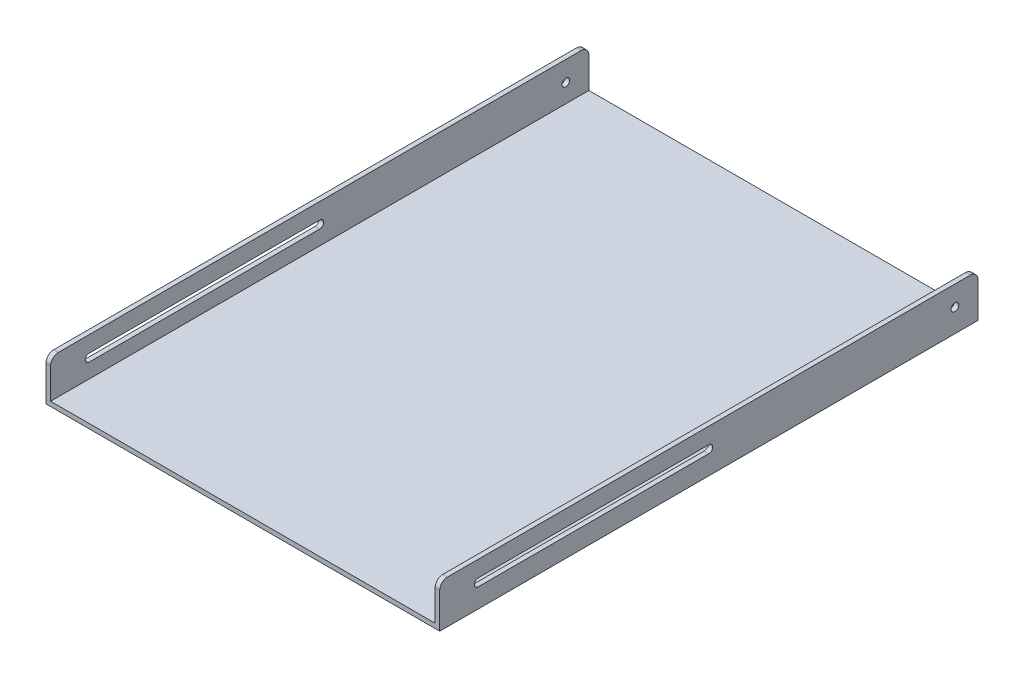
ISO-10303-21;
HEADER;
FILE_DESCRIPTION(('STEP AP214'),'2;1');
FILE_NAME('part.step','',(''),(''),'','','');
FILE_SCHEMA(('AUTOMOTIVE_DESIGN { 1 0 10303 214 1 1 1 1 }'));
ENDSEC;
DATA;
#1=APPLICATION_CONTEXT('core data for automotive mechanical design processes');
#2=APPLICATION_PROTOCOL_DEFINITION('international standard','automotive_design',2000,#1);
#3=PRODUCT_CONTEXT('',#1,'mechanical');
#4=PRODUCT('Part','Part','',(#3));
#5=PRODUCT_RELATED_PRODUCT_CATEGORY('part','',(#4));
#6=PRODUCT_DEFINITION_FORMATION('','',#4);
#7=PRODUCT_DEFINITION_CONTEXT('part definition',#1,'design');
#8=PRODUCT_DEFINITION('design','',#6,#7);
#9=PRODUCT_DEFINITION_SHAPE('','',#8);
#10=(LENGTH_UNIT() NAMED_UNIT(*) SI_UNIT(.MILLI.,.METRE.));
#11=(NAMED_UNIT(*) PLANE_ANGLE_UNIT() SI_UNIT($,.RADIAN.));
#12=(NAMED_UNIT(*) SI_UNIT($,.STERADIAN.) SOLID_ANGLE_UNIT());
#13=UNCERTAINTY_MEASURE_WITH_UNIT(LENGTH_MEASURE(1.E-05),#10,'distance_accuracy_value','');
#14=(GEOMETRIC_REPRESENTATION_CONTEXT(3) GLOBAL_UNCERTAINTY_ASSIGNED_CONTEXT((#13)) GLOBAL_UNIT_ASSIGNED_CONTEXT((#10,
#11,#12)) REPRESENTATION_CONTEXT('',''));
#15=CARTESIAN_POINT('',(0.,0.,0.));
#16=DIRECTION('',(0.,0.,1.));
#17=DIRECTION('',(1.,0.,0.));
#18=AXIS2_PLACEMENT_3D('',#15,#16,#17);
#19=CARTESIAN_POINT('',(256.,0.,350.));
#20=DIRECTION('',(-1.,0.,0.));
#21=DIRECTION('',(0.,0.,1.));
#22=AXIS2_PLACEMENT_3D('',#19,#20,#21);
#23=PLANE('',#22);
#24=CARTESIAN_POINT('',(256.,24.,-320.));
#25=DIRECTION('',(1.,0.,0.));
#26=DIRECTION('',(0.,0.,-1.));
#27=AXIS2_PLACEMENT_3D('',#24,#25,#26);
#28=CIRCLE('',#27,4.99999999999999);
#29=CARTESIAN_POINT('',(256.,24.,-325.));
#30=VERTEX_POINT('',#29);
#31=EDGE_CURVE('E217',#30,#30,#28,.T.);
#32=ORIENTED_EDGE('',*,*,#31,.F.);
#33=EDGE_LOOP('',(#32));
#34=FACE_BOUND('',#33,.T.);
#35=DIRECTION('',(0.,0.,1.));
#36=VECTOR('',#35,1.);
#37=CARTESIAN_POINT('',(256.,29.,0.));
#38=LINE('',#37,#36);
#39=CARTESIAN_POINT('',(256.,29.,0.));
#40=VERTEX_POINT('',#39);
#41=CARTESIAN_POINT('',(256.,28.9999999999999,300.));
#42=VERTEX_POINT('',#41);
#43=EDGE_CURVE('E227',#40,#42,#38,.T.);
#44=ORIENTED_EDGE('',*,*,#43,.F.);
#45=CARTESIAN_POINT('',(256.,24.,0.));
#46=DIRECTION('',(1.,0.,0.));
#47=DIRECTION('',(0.,0.,-1.));
#48=AXIS2_PLACEMENT_3D('',#45,#46,#47);
#49=CIRCLE('',#48,5.);
#50=CARTESIAN_POINT('',(256.,19.,0.));
#51=VERTEX_POINT('',#50);
#52=EDGE_CURVE('E224',#51,#40,#49,.T.);
#53=ORIENTED_EDGE('',*,*,#52,.F.);
#54=DIRECTION('',(0.,0.,-1.));
#55=VECTOR('',#54,1.);
#56=CARTESIAN_POINT('',(256.,19.,0.));
#57=LINE('',#56,#55);
#58=CARTESIAN_POINT('',(256.,18.9999999999999,300.));
#59=VERTEX_POINT('',#58);
#60=EDGE_CURVE('E210',#59,#51,#57,.T.);
#61=ORIENTED_EDGE('',*,*,#60,.F.);
#62=CARTESIAN_POINT('',(256.,23.9999999999999,300.));
#63=DIRECTION('',(1.,0.,0.));
#64=DIRECTION('',(0.,0.,-1.));
#65=AXIS2_PLACEMENT_3D('',#62,#63,#64);
#66=CIRCLE('',#65,5.);
#67=EDGE_CURVE('E214',#42,#59,#66,.T.);
#68=ORIENTED_EDGE('',*,*,#67,.F.);
#69=EDGE_LOOP('',(#44,#53,#61,#68));
#70=FACE_BOUND('',#69,.T.);
#71=DIRECTION('',(0.,1.,0.));
#72=VECTOR('',#71,1.);
#73=CARTESIAN_POINT('',(256.,0.,-350.));
#74=LINE('',#73,#72);
#75=CARTESIAN_POINT('',(256.,-6.,-350.));
#76=VERTEX_POINT('',#75);
#77=CARTESIAN_POINT('',(256.,40.,-350.));
#78=VERTEX_POINT('',#77);
#79=EDGE_CURVE('E278',#76,#78,#74,.T.);
#80=ORIENTED_EDGE('',*,*,#79,.T.);
#81=CARTESIAN_POINT('',(256.,40.,-340.));
#82=DIRECTION('',(-1.,0.,0.));
#83=DIRECTION('',(0.,0.,1.));
#84=AXIS2_PLACEMENT_3D('',#81,#82,#83);
#85=CIRCLE('',#84,10.);
#86=CARTESIAN_POINT('',(256.,50.,-340.));
#87=VERTEX_POINT('',#86);
#88=EDGE_CURVE('E377',#78,#87,#85,.F.);
#89=ORIENTED_EDGE('',*,*,#88,.T.);
#90=DIRECTION('',(0.,0.,-1.));
#91=VECTOR('',#90,1.);
#92=CARTESIAN_POINT('',(256.,50.,350.));
#93=LINE('',#92,#91);
#94=CARTESIAN_POINT('',(256.,50.,340.));
#95=VERTEX_POINT('',#94);
#96=EDGE_CURVE('E344',#95,#87,#93,.T.);
#97=ORIENTED_EDGE('',*,*,#96,.F.);
#98=CARTESIAN_POINT('',(256.,40.,340.));
#99=DIRECTION('',(-1.,0.,0.));
#100=DIRECTION('',(0.,0.,1.));
#101=AXIS2_PLACEMENT_3D('',#98,#99,#100);
#102=CIRCLE('',#101,10.);
#103=CARTESIAN_POINT('',(256.,40.,350.));
#104=VERTEX_POINT('',#103);
#105=EDGE_CURVE('E374',#95,#104,#102,.F.);
#106=ORIENTED_EDGE('',*,*,#105,.T.);
#107=DIRECTION('',(0.,1.,0.));
#108=VECTOR('',#107,1.);
#109=CARTESIAN_POINT('',(256.,0.,350.));
#110=LINE('',#109,#108);
#111=CARTESIAN_POINT('',(256.,-6.,350.));
#112=VERTEX_POINT('',#111);
#113=EDGE_CURVE('E279',#112,#104,#110,.T.);
#114=ORIENTED_EDGE('',*,*,#113,.F.);
#115=DIRECTION('',(0.,0.,-1.));
#116=VECTOR('',#115,1.);
#117=CARTESIAN_POINT('',(256.,-6.,350.));
#118=LINE('',#117,#116);
#119=EDGE_CURVE('E299',#112,#76,#118,.T.);
#120=ORIENTED_EDGE('',*,*,#119,.T.);
#121=EDGE_LOOP('',(#80,#89,#97,#106,#114,#120));
#122=FACE_BOUND('',#121,.T.);
#123=ADVANCED_FACE('F39',(#34,#70,#122),#23,.F.);
#124=CARTESIAN_POINT('',(250.,50.,350.));
#125=DIRECTION('',(0.,1.,0.));
#126=DIRECTION('',(0.,0.,1.));
#127=AXIS2_PLACEMENT_3D('',#124,#125,#126);
#128=PLANE('',#127);
#129=ORIENTED_EDGE('',*,*,#96,.T.);
#130=DIRECTION('',(1.,0.,0.));
#131=VECTOR('',#130,1.);
#132=CARTESIAN_POINT('',(250.,50.,-340.));
#133=LINE('',#132,#131);
#134=CARTESIAN_POINT('',(250.,50.,-340.));
#135=VERTEX_POINT('',#134);
#136=EDGE_CURVE('E61',#87,#135,#133,.F.);
#137=ORIENTED_EDGE('',*,*,#136,.T.);
#138=DIRECTION('',(0.,0.,-1.));
#139=VECTOR('',#138,1.);
#140=CARTESIAN_POINT('',(250.,50.,350.));
#141=LINE('',#140,#139);
#142=CARTESIAN_POINT('',(250.,50.,340.));
#143=VERTEX_POINT('',#142);
#144=EDGE_CURVE('E341',#143,#135,#141,.T.);
#145=ORIENTED_EDGE('',*,*,#144,.F.);
#146=DIRECTION('',(1.,0.,0.));
#147=VECTOR('',#146,1.);
#148=CARTESIAN_POINT('',(256.,50.,340.));
#149=LINE('',#148,#147);
#150=EDGE_CURVE('E380',#143,#95,#149,.T.);
#151=ORIENTED_EDGE('',*,*,#150,.T.);
#152=EDGE_LOOP('',(#129,#137,#145,#151));
#153=FACE_BOUND('',#152,.T.);
#154=ADVANCED_FACE('F431',(#153),#128,.T.);
#155=CARTESIAN_POINT('',(250.,0.,350.));
#156=DIRECTION('',(-1.,0.,0.));
#157=DIRECTION('',(0.,0.,1.));
#158=AXIS2_PLACEMENT_3D('',#155,#156,#157);
#159=PLANE('',#158);
#160=CARTESIAN_POINT('',(250.,24.,-320.));
#161=DIRECTION('',(-1.,0.,0.));
#162=DIRECTION('',(0.,0.,1.));
#163=AXIS2_PLACEMENT_3D('',#160,#161,#162);
#164=CIRCLE('',#163,4.99999999999999);
#165=CARTESIAN_POINT('',(250.,24.,-315.));
#166=VERTEX_POINT('',#165);
#167=EDGE_CURVE('E274',#166,#166,#164,.T.);
#168=ORIENTED_EDGE('',*,*,#167,.F.);
#169=EDGE_LOOP('',(#168));
#170=FACE_BOUND('',#169,.T.);
#171=CARTESIAN_POINT('',(250.,24.,0.));
#172=DIRECTION('',(-1.,0.,0.));
#173=DIRECTION('',(0.,0.,1.));
#174=AXIS2_PLACEMENT_3D('',#171,#172,#173);
#175=CIRCLE('',#174,5.);
#176=CARTESIAN_POINT('',(250.,29.,0.));
#177=VERTEX_POINT('',#176);
#178=CARTESIAN_POINT('',(250.,19.,0.));
#179=VERTEX_POINT('',#178);
#180=EDGE_CURVE('E267',#177,#179,#175,.T.);
#181=ORIENTED_EDGE('',*,*,#180,.F.);
#182=DIRECTION('',(0.,0.,-1.));
#183=VECTOR('',#182,1.);
#184=CARTESIAN_POINT('',(250.,28.9999999999999,350.));
#185=LINE('',#184,#183);
#186=CARTESIAN_POINT('',(250.,28.9999999999999,300.));
#187=VERTEX_POINT('',#186);
#188=EDGE_CURVE('E248',#187,#177,#185,.T.);
#189=ORIENTED_EDGE('',*,*,#188,.F.);
#190=CARTESIAN_POINT('',(250.,23.9999999999999,300.));
#191=DIRECTION('',(-1.,0.,0.));
#192=DIRECTION('',(0.,0.,1.));
#193=AXIS2_PLACEMENT_3D('',#190,#191,#192);
#194=CIRCLE('',#193,5.);
#195=CARTESIAN_POINT('',(250.,18.9999999999999,300.));
#196=VERTEX_POINT('',#195);
#197=EDGE_CURVE('E255',#196,#187,#194,.T.);
#198=ORIENTED_EDGE('',*,*,#197,.F.);
#199=DIRECTION('',(0.,0.,1.));
#200=VECTOR('',#199,1.);
#201=CARTESIAN_POINT('',(250.,18.9999999999999,350.));
#202=LINE('',#201,#200);
#203=EDGE_CURVE('E262',#179,#196,#202,.T.);
#204=ORIENTED_EDGE('',*,*,#203,.F.);
#205=EDGE_LOOP('',(#181,#189,#198,#204));
#206=FACE_BOUND('',#205,.T.);
#207=ORIENTED_EDGE('',*,*,#144,.T.);
#208=CARTESIAN_POINT('',(250.,40.,-340.));
#209=DIRECTION('',(-1.,0.,0.));
#210=DIRECTION('',(0.,0.,1.));
#211=AXIS2_PLACEMENT_3D('',#208,#209,#210);
#212=CIRCLE('',#211,10.);
#213=CARTESIAN_POINT('',(250.,40.,-350.));
#214=VERTEX_POINT('',#213);
#215=EDGE_CURVE('E389',#135,#214,#212,.T.);
#216=ORIENTED_EDGE('',*,*,#215,.T.);
#217=DIRECTION('',(0.,1.,0.));
#218=VECTOR('',#217,1.);
#219=CARTESIAN_POINT('',(250.,0.,-350.));
#220=LINE('',#219,#218);
#221=CARTESIAN_POINT('',(250.,0.,-350.));
#222=VERTEX_POINT('',#221);
#223=EDGE_CURVE('E303',#222,#214,#220,.T.);
#224=ORIENTED_EDGE('',*,*,#223,.F.);
#225=DIRECTION('',(0.,0.,-1.));
#226=VECTOR('',#225,1.);
#227=CARTESIAN_POINT('',(250.,0.,350.));
#228=LINE('',#227,#226);
#229=CARTESIAN_POINT('',(250.,0.,350.));
#230=VERTEX_POINT('',#229);
#231=EDGE_CURVE('E338',#230,#222,#228,.T.);
#232=ORIENTED_EDGE('',*,*,#231,.F.);
#233=DIRECTION('',(0.,1.,0.));
#234=VECTOR('',#233,1.);
#235=CARTESIAN_POINT('',(250.,0.,350.));
#236=LINE('',#235,#234);
#237=CARTESIAN_POINT('',(250.,40.,350.));
#238=VERTEX_POINT('',#237);
#239=EDGE_CURVE('E282',#230,#238,#236,.T.);
#240=ORIENTED_EDGE('',*,*,#239,.T.);
#241=CARTESIAN_POINT('',(250.,40.,340.));
#242=DIRECTION('',(-1.,0.,0.));
#243=DIRECTION('',(0.,0.,1.));
#244=AXIS2_PLACEMENT_3D('',#241,#242,#243);
#245=CIRCLE('',#244,10.);
#246=EDGE_CURVE('E386',#238,#143,#245,.T.);
#247=ORIENTED_EDGE('',*,*,#246,.T.);
#248=EDGE_LOOP('',(#207,#216,#224,#232,#240,#247));
#249=FACE_BOUND('',#248,.T.);
#250=ADVANCED_FACE('F429',(#170,#206,#249),#159,.T.);
#251=CARTESIAN_POINT('',(-250.,0.,350.));
#252=DIRECTION('',(0.,1.,0.));
#253=DIRECTION('',(0.,0.,1.));
#254=AXIS2_PLACEMENT_3D('',#251,#252,#253);
#255=PLANE('',#254);
#256=DIRECTION('',(1.,0.,0.));
#257=VECTOR('',#256,1.);
#258=CARTESIAN_POINT('',(-250.,0.,-350.));
#259=LINE('',#258,#257);
#260=CARTESIAN_POINT('',(-250.,0.,-350.));
#261=VERTEX_POINT('',#260);
#262=EDGE_CURVE('E307',#261,#222,#259,.T.);
#263=ORIENTED_EDGE('',*,*,#262,.F.);
#264=DIRECTION('',(0.,0.,-1.));
#265=VECTOR('',#264,1.);
#266=CARTESIAN_POINT('',(-250.,0.,350.));
#267=LINE('',#266,#265);
#268=CARTESIAN_POINT('',(-250.,0.,350.));
#269=VERTEX_POINT('',#268);
#270=EDGE_CURVE('E334',#269,#261,#267,.T.);
#271=ORIENTED_EDGE('',*,*,#270,.F.);
#272=DIRECTION('',(1.,0.,0.));
#273=VECTOR('',#272,1.);
#274=CARTESIAN_POINT('',(-250.,0.,350.));
#275=LINE('',#274,#273);
#276=EDGE_CURVE('E286',#269,#230,#275,.T.);
#277=ORIENTED_EDGE('',*,*,#276,.T.);
#278=ORIENTED_EDGE('',*,*,#231,.T.);
#279=EDGE_LOOP('',(#263,#271,#277,#278));
#280=FACE_BOUND('',#279,.T.);
#281=ADVANCED_FACE('F440',(#280),#255,.T.);
#282=CARTESIAN_POINT('',(-250.,0.,350.));
#283=DIRECTION('',(1.,0.,0.));
#284=DIRECTION('',(0.,0.,-1.));
#285=AXIS2_PLACEMENT_3D('',#282,#283,#284);
#286=PLANE('',#285);
#287=CARTESIAN_POINT('',(-250.,24.,-320.));
#288=DIRECTION('',(1.,0.,0.));
#289=DIRECTION('',(0.,0.,-1.));
#290=AXIS2_PLACEMENT_3D('',#287,#288,#289);
#291=CIRCLE('',#290,4.99999999999999);
#292=CARTESIAN_POINT('',(-250.,24.,-325.));
#293=VERTEX_POINT('',#292);
#294=EDGE_CURVE('E270',#293,#293,#291,.T.);
#295=ORIENTED_EDGE('',*,*,#294,.F.);
#296=EDGE_LOOP('',(#295));
#297=FACE_BOUND('',#296,.T.);
#298=CARTESIAN_POINT('',(-250.,24.,0.));
#299=DIRECTION('',(1.,0.,0.));
#300=DIRECTION('',(0.,0.,-1.));
#301=AXIS2_PLACEMENT_3D('',#298,#299,#300);
#302=CIRCLE('',#301,5.);
#303=CARTESIAN_POINT('',(-250.,19.,0.));
#304=VERTEX_POINT('',#303);
#305=CARTESIAN_POINT('',(-250.,29.,0.));
#306=VERTEX_POINT('',#305);
#307=EDGE_CURVE('E187',#304,#306,#302,.T.);
#308=ORIENTED_EDGE('',*,*,#307,.F.);
#309=DIRECTION('',(0.,0.,-1.));
#310=VECTOR('',#309,1.);
#311=CARTESIAN_POINT('',(-250.,18.9999999999999,350.));
#312=LINE('',#311,#310);
#313=CARTESIAN_POINT('',(-250.,18.9999999999999,300.));
#314=VERTEX_POINT('',#313);
#315=EDGE_CURVE('E259',#314,#304,#312,.T.);
#316=ORIENTED_EDGE('',*,*,#315,.F.);
#317=CARTESIAN_POINT('',(-250.,23.9999999999999,300.));
#318=DIRECTION('',(1.,0.,0.));
#319=DIRECTION('',(0.,0.,-1.));
#320=AXIS2_PLACEMENT_3D('',#317,#318,#319);
#321=CIRCLE('',#320,5.);
#322=CARTESIAN_POINT('',(-250.,28.9999999999999,300.));
#323=VERTEX_POINT('',#322);
#324=EDGE_CURVE('E252',#323,#314,#321,.T.);
#325=ORIENTED_EDGE('',*,*,#324,.F.);
#326=DIRECTION('',(0.,0.,1.));
#327=VECTOR('',#326,1.);
#328=CARTESIAN_POINT('',(-250.,28.9999999999999,350.));
#329=LINE('',#328,#327);
#330=EDGE_CURVE('E245',#306,#323,#329,.T.);
#331=ORIENTED_EDGE('',*,*,#330,.F.);
#332=EDGE_LOOP('',(#308,#316,#325,#331));
#333=FACE_BOUND('',#332,.T.);
#334=DIRECTION('',(0.,-1.,0.));
#335=VECTOR('',#334,1.);
#336=CARTESIAN_POINT('',(-250.,0.,-350.));
#337=LINE('',#336,#335);
#338=CARTESIAN_POINT('',(-250.,40.,-350.));
#339=VERTEX_POINT('',#338);
#340=EDGE_CURVE('E311',#339,#261,#337,.T.);
#341=ORIENTED_EDGE('',*,*,#340,.F.);
#342=CARTESIAN_POINT('',(-250.,40.,-340.));
#343=DIRECTION('',(1.,0.,0.));
#344=DIRECTION('',(0.,0.,-1.));
#345=AXIS2_PLACEMENT_3D('',#342,#343,#344);
#346=CIRCLE('',#345,10.);
#347=CARTESIAN_POINT('',(-250.,50.,-340.));
#348=VERTEX_POINT('',#347);
#349=EDGE_CURVE('E358',#339,#348,#346,.T.);
#350=ORIENTED_EDGE('',*,*,#349,.T.);
#351=DIRECTION('',(0.,0.,-1.));
#352=VECTOR('',#351,1.);
#353=CARTESIAN_POINT('',(-250.,50.,350.));
#354=LINE('',#353,#352);
#355=CARTESIAN_POINT('',(-250.,50.,340.));
#356=VERTEX_POINT('',#355);
#357=EDGE_CURVE('E330',#356,#348,#354,.T.);
#358=ORIENTED_EDGE('',*,*,#357,.F.);
#359=CARTESIAN_POINT('',(-250.,40.,340.));
#360=DIRECTION('',(1.,0.,0.));
#361=DIRECTION('',(0.,0.,-1.));
#362=AXIS2_PLACEMENT_3D('',#359,#360,#361);
#363=CIRCLE('',#362,10.);
#364=CARTESIAN_POINT('',(-250.,40.,350.));
#365=VERTEX_POINT('',#364);
#366=EDGE_CURVE('E355',#356,#365,#363,.T.);
#367=ORIENTED_EDGE('',*,*,#366,.T.);
#368=DIRECTION('',(0.,-1.,0.));
#369=VECTOR('',#368,1.);
#370=CARTESIAN_POINT('',(-250.,0.,350.));
#371=LINE('',#370,#369);
#372=EDGE_CURVE('E290',#365,#269,#371,.T.);
#373=ORIENTED_EDGE('',*,*,#372,.T.);
#374=ORIENTED_EDGE('',*,*,#270,.T.);
#375=EDGE_LOOP('',(#341,#350,#358,#367,#373,#374));
#376=FACE_BOUND('',#375,.T.);
#377=ADVANCED_FACE('F409',(#297,#333,#376),#286,.T.);
#378=CARTESIAN_POINT('',(-256.,50.,350.));
#379=DIRECTION('',(0.,1.,0.));
#380=DIRECTION('',(0.,0.,1.));
#381=AXIS2_PLACEMENT_3D('',#378,#379,#380);
#382=PLANE('',#381);
#383=ORIENTED_EDGE('',*,*,#357,.T.);
#384=DIRECTION('',(1.,0.,0.));
#385=VECTOR('',#384,1.);
#386=CARTESIAN_POINT('',(-256.,50.,-340.));
#387=LINE('',#386,#385);
#388=CARTESIAN_POINT('',(-256.,50.,-340.));
#389=VERTEX_POINT('',#388);
#390=EDGE_CURVE('E365',#348,#389,#387,.F.);
#391=ORIENTED_EDGE('',*,*,#390,.T.);
#392=DIRECTION('',(0.,0.,-1.));
#393=VECTOR('',#392,1.);
#394=CARTESIAN_POINT('',(-256.,50.,350.));
#395=LINE('',#394,#393);
#396=CARTESIAN_POINT('',(-256.,50.,340.));
#397=VERTEX_POINT('',#396);
#398=EDGE_CURVE('E326',#397,#389,#395,.T.);
#399=ORIENTED_EDGE('',*,*,#398,.F.);
#400=DIRECTION('',(1.,0.,0.));
#401=VECTOR('',#400,1.);
#402=CARTESIAN_POINT('',(-250.,50.,340.));
#403=LINE('',#402,#401);
#404=EDGE_CURVE('E361',#397,#356,#403,.T.);
#405=ORIENTED_EDGE('',*,*,#404,.T.);
#406=EDGE_LOOP('',(#383,#391,#399,#405));
#407=FACE_BOUND('',#406,.T.);
#408=ADVANCED_FACE('F405',(#407),#382,.T.);
#409=CARTESIAN_POINT('',(-256.,0.,350.));
#410=DIRECTION('',(1.,0.,0.));
#411=DIRECTION('',(0.,0.,-1.));
#412=AXIS2_PLACEMENT_3D('',#409,#410,#411);
#413=PLANE('',#412);
#414=CARTESIAN_POINT('',(-256.,24.,-320.));
#415=DIRECTION('',(1.,0.,0.));
#416=DIRECTION('',(0.,0.,-1.));
#417=AXIS2_PLACEMENT_3D('',#414,#415,#416);
#418=CIRCLE('',#417,4.99999999999999);
#419=CARTESIAN_POINT('',(-256.,24.,-325.));
#420=VERTEX_POINT('',#419);
#421=EDGE_CURVE('E249',#420,#420,#418,.T.);
#422=ORIENTED_EDGE('',*,*,#421,.T.);
#423=EDGE_LOOP('',(#422));
#424=FACE_BOUND('',#423,.T.);
#425=DIRECTION('',(0.,0.,-1.));
#426=VECTOR('',#425,1.);
#427=CARTESIAN_POINT('',(-256.,19.,0.));
#428=LINE('',#427,#426);
#429=CARTESIAN_POINT('',(-256.,18.9999999999999,300.));
#430=VERTEX_POINT('',#429);
#431=CARTESIAN_POINT('',(-256.,19.,0.));
#432=VERTEX_POINT('',#431);
#433=EDGE_CURVE('E208',#430,#432,#428,.T.);
#434=ORIENTED_EDGE('',*,*,#433,.T.);
#435=CARTESIAN_POINT('',(-256.,24.,0.));
#436=DIRECTION('',(1.,0.,0.));
#437=DIRECTION('',(0.,0.,-1.));
#438=AXIS2_PLACEMENT_3D('',#435,#436,#437);
#439=CIRCLE('',#438,5.);
#440=CARTESIAN_POINT('',(-256.,29.,0.));
#441=VERTEX_POINT('',#440);
#442=EDGE_CURVE('E184',#432,#441,#439,.T.);
#443=ORIENTED_EDGE('',*,*,#442,.T.);
#444=DIRECTION('',(0.,0.,1.));
#445=VECTOR('',#444,1.);
#446=CARTESIAN_POINT('',(-256.,29.,0.));
#447=LINE('',#446,#445);
#448=CARTESIAN_POINT('',(-256.,28.9999999999999,300.));
#449=VERTEX_POINT('',#448);
#450=EDGE_CURVE('E196',#441,#449,#447,.T.);
#451=ORIENTED_EDGE('',*,*,#450,.T.);
#452=CARTESIAN_POINT('',(-256.,23.9999999999999,300.));
#453=DIRECTION('',(1.,0.,0.));
#454=DIRECTION('',(0.,0.,-1.));
#455=AXIS2_PLACEMENT_3D('',#452,#453,#454);
#456=CIRCLE('',#455,5.);
#457=EDGE_CURVE('E203',#449,#430,#456,.T.);
#458=ORIENTED_EDGE('',*,*,#457,.T.);
#459=EDGE_LOOP('',(#434,#443,#451,#458));
#460=FACE_BOUND('',#459,.T.);
#461=ORIENTED_EDGE('',*,*,#398,.T.);
#462=CARTESIAN_POINT('',(-256.,40.,-340.));
#463=DIRECTION('',(1.,0.,0.));
#464=DIRECTION('',(0.,0.,-1.));
#465=AXIS2_PLACEMENT_3D('',#462,#463,#464);
#466=CIRCLE('',#465,10.);
#467=CARTESIAN_POINT('',(-256.,40.,-350.));
#468=VERTEX_POINT('',#467);
#469=EDGE_CURVE('E371',#389,#468,#466,.F.);
#470=ORIENTED_EDGE('',*,*,#469,.T.);
#471=DIRECTION('',(0.,1.,0.));
#472=VECTOR('',#471,1.);
#473=CARTESIAN_POINT('',(-256.,0.,-350.));
#474=LINE('',#473,#472);
#475=CARTESIAN_POINT('',(-256.,-6.,-350.));
#476=VERTEX_POINT('',#475);
#477=EDGE_CURVE('E314',#468,#476,#474,.F.);
#478=ORIENTED_EDGE('',*,*,#477,.T.);
#479=DIRECTION('',(0.,0.,-1.));
#480=VECTOR('',#479,1.);
#481=CARTESIAN_POINT('',(-256.,-6.,350.));
#482=LINE('',#481,#480);
#483=CARTESIAN_POINT('',(-256.,-6.,350.));
#484=VERTEX_POINT('',#483);
#485=EDGE_CURVE('E322',#484,#476,#482,.T.);
#486=ORIENTED_EDGE('',*,*,#485,.F.);
#487=DIRECTION('',(0.,1.,0.));
#488=VECTOR('',#487,1.);
#489=CARTESIAN_POINT('',(-256.,0.,350.));
#490=LINE('',#489,#488);
#491=CARTESIAN_POINT('',(-256.,40.,350.));
#492=VERTEX_POINT('',#491);
#493=EDGE_CURVE('E293',#492,#484,#490,.F.);
#494=ORIENTED_EDGE('',*,*,#493,.F.);
#495=CARTESIAN_POINT('',(-256.,40.,340.));
#496=DIRECTION('',(1.,0.,0.));
#497=DIRECTION('',(0.,0.,-1.));
#498=AXIS2_PLACEMENT_3D('',#495,#496,#497);
#499=CIRCLE('',#498,10.);
#500=EDGE_CURVE('E368',#492,#397,#499,.F.);
#501=ORIENTED_EDGE('',*,*,#500,.T.);
#502=EDGE_LOOP('',(#461,#470,#478,#486,#494,#501));
#503=FACE_BOUND('',#502,.T.);
#504=ADVANCED_FACE('F205',(#424,#460,#503),#413,.F.);
#505=CARTESIAN_POINT('',(-250.,-6.,350.));
#506=DIRECTION('',(0.,1.,0.));
#507=DIRECTION('',(0.,0.,1.));
#508=AXIS2_PLACEMENT_3D('',#505,#506,#507);
#509=PLANE('',#508);
#510=DIRECTION('',(1.,0.,0.));
#511=VECTOR('',#510,1.);
#512=CARTESIAN_POINT('',(-250.,-6.,-350.));
#513=LINE('',#512,#511);
#514=EDGE_CURVE('E283',#476,#76,#513,.T.);
#515=ORIENTED_EDGE('',*,*,#514,.T.);
#516=ORIENTED_EDGE('',*,*,#119,.F.);
#517=DIRECTION('',(1.,0.,0.));
#518=VECTOR('',#517,1.);
#519=CARTESIAN_POINT('',(-250.,-6.,350.));
#520=LINE('',#519,#518);
#521=EDGE_CURVE('E296',#484,#112,#520,.T.);
#522=ORIENTED_EDGE('',*,*,#521,.F.);
#523=ORIENTED_EDGE('',*,*,#485,.T.);
#524=EDGE_LOOP('',(#515,#516,#522,#523));
#525=FACE_BOUND('',#524,.T.);
#526=ADVANCED_FACE('F420',(#525),#509,.F.);
#527=CARTESIAN_POINT('',(0.,0.,350.));
#528=DIRECTION('',(0.,0.,-1.));
#529=DIRECTION('',(-1.,0.,0.));
#530=AXIS2_PLACEMENT_3D('',#527,#528,#529);
#531=PLANE('',#530);
#532=ORIENTED_EDGE('',*,*,#113,.T.);
#533=DIRECTION('',(1.,0.,0.));
#534=VECTOR('',#533,1.);
#535=CARTESIAN_POINT('',(250.,40.,350.));
#536=LINE('',#535,#534);
#537=EDGE_CURVE('E11',#104,#238,#536,.F.);
#538=ORIENTED_EDGE('',*,*,#537,.T.);
#539=ORIENTED_EDGE('',*,*,#239,.F.);
#540=ORIENTED_EDGE('',*,*,#276,.F.);
#541=ORIENTED_EDGE('',*,*,#372,.F.);
#542=DIRECTION('',(1.,0.,0.));
#543=VECTOR('',#542,1.);
#544=CARTESIAN_POINT('',(-256.,40.,350.));
#545=LINE('',#544,#543);
#546=EDGE_CURVE('E48',#365,#492,#545,.F.);
#547=ORIENTED_EDGE('',*,*,#546,.T.);
#548=ORIENTED_EDGE('',*,*,#493,.T.);
#549=ORIENTED_EDGE('',*,*,#521,.T.);
#550=EDGE_LOOP('',(#532,#538,#539,#540,#541,#547,#548,#549));
#551=FACE_BOUND('',#550,.T.);
#552=ADVANCED_FACE('F395',(#551),#531,.F.);
#553=CARTESIAN_POINT('',(0.,0.,-350.));
#554=DIRECTION('',(0.,0.,-1.));
#555=DIRECTION('',(-1.,0.,0.));
#556=AXIS2_PLACEMENT_3D('',#553,#554,#555);
#557=PLANE('',#556);
#558=ORIENTED_EDGE('',*,*,#477,.F.);
#559=DIRECTION('',(1.,0.,0.));
#560=VECTOR('',#559,1.);
#561=CARTESIAN_POINT('',(0.,40.,-350.));
#562=LINE('',#561,#560);
#563=EDGE_CURVE('E351',#468,#339,#562,.T.);
#564=ORIENTED_EDGE('',*,*,#563,.T.);
#565=ORIENTED_EDGE('',*,*,#340,.T.);
#566=ORIENTED_EDGE('',*,*,#262,.T.);
#567=ORIENTED_EDGE('',*,*,#223,.T.);
#568=DIRECTION('',(1.,0.,0.));
#569=VECTOR('',#568,1.);
#570=CARTESIAN_POINT('',(0.,40.,-350.));
#571=LINE('',#570,#569);
#572=EDGE_CURVE('E347',#214,#78,#571,.T.);
#573=ORIENTED_EDGE('',*,*,#572,.T.);
#574=ORIENTED_EDGE('',*,*,#79,.F.);
#575=ORIENTED_EDGE('',*,*,#514,.F.);
#576=EDGE_LOOP('',(#558,#564,#565,#566,#567,#573,#574,#575));
#577=FACE_BOUND('',#576,.T.);
#578=ADVANCED_FACE('F416',(#577),#557,.T.);
#579=CARTESIAN_POINT('',(-256.,29.,0.));
#580=DIRECTION('',(0.,1.,0.));
#581=DIRECTION('',(0.,0.,1.));
#582=AXIS2_PLACEMENT_3D('',#579,#580,#581);
#583=PLANE('',#582);
#584=ORIENTED_EDGE('',*,*,#330,.T.);
#585=DIRECTION('',(1.,0.,0.));
#586=VECTOR('',#585,1.);
#587=CARTESIAN_POINT('',(-256.,28.9999999999999,300.));
#588=LINE('',#587,#586);
#589=EDGE_CURVE('E199',#449,#323,#588,.T.);
#590=ORIENTED_EDGE('',*,*,#589,.F.);
#591=ORIENTED_EDGE('',*,*,#450,.F.);
#592=DIRECTION('',(1.,0.,0.));
#593=VECTOR('',#592,1.);
#594=CARTESIAN_POINT('',(-256.,29.,0.));
#595=LINE('',#594,#593);
#596=EDGE_CURVE('E179',#441,#306,#595,.T.);
#597=ORIENTED_EDGE('',*,*,#596,.T.);
#598=EDGE_LOOP('',(#584,#590,#591,#597));
#599=FACE_BOUND('',#598,.T.);
#600=ADVANCED_FACE('F197',(#599),#583,.F.);
#601=CARTESIAN_POINT('',(-256.,23.9999999999999,300.));
#602=DIRECTION('',(1.,0.,0.));
#603=DIRECTION('',(0.,0.,-1.));
#604=AXIS2_PLACEMENT_3D('',#601,#602,#603);
#605=CYLINDRICAL_SURFACE('',#604,5.);
#606=ORIENTED_EDGE('',*,*,#324,.T.);
#607=DIRECTION('',(1.,0.,0.));
#608=VECTOR('',#607,1.);
#609=CARTESIAN_POINT('',(-256.,18.9999999999999,300.));
#610=LINE('',#609,#608);
#611=EDGE_CURVE('E238',#430,#314,#610,.T.);
#612=ORIENTED_EDGE('',*,*,#611,.F.);
#613=ORIENTED_EDGE('',*,*,#457,.F.);
#614=ORIENTED_EDGE('',*,*,#589,.T.);
#615=EDGE_LOOP('',(#606,#612,#613,#614));
#616=FACE_BOUND('',#615,.T.);
#617=ADVANCED_FACE('F580',(#616),#605,.F.);
#618=CARTESIAN_POINT('',(-256.,19.,0.));
#619=DIRECTION('',(0.,-1.,0.));
#620=DIRECTION('',(0.,0.,-1.));
#621=AXIS2_PLACEMENT_3D('',#618,#619,#620);
#622=PLANE('',#621);
#623=ORIENTED_EDGE('',*,*,#315,.T.);
#624=DIRECTION('',(1.,0.,0.));
#625=VECTOR('',#624,1.);
#626=CARTESIAN_POINT('',(-256.,19.,0.));
#627=LINE('',#626,#625);
#628=EDGE_CURVE('E234',#432,#304,#627,.T.);
#629=ORIENTED_EDGE('',*,*,#628,.F.);
#630=ORIENTED_EDGE('',*,*,#433,.F.);
#631=ORIENTED_EDGE('',*,*,#611,.T.);
#632=EDGE_LOOP('',(#623,#629,#630,#631));
#633=FACE_BOUND('',#632,.T.);
#634=ADVANCED_FACE('F591',(#633),#622,.F.);
#635=CARTESIAN_POINT('',(-256.,24.,0.));
#636=DIRECTION('',(1.,0.,0.));
#637=DIRECTION('',(0.,0.,-1.));
#638=AXIS2_PLACEMENT_3D('',#635,#636,#637);
#639=CYLINDRICAL_SURFACE('',#638,5.);
#640=ORIENTED_EDGE('',*,*,#307,.T.);
#641=ORIENTED_EDGE('',*,*,#596,.F.);
#642=ORIENTED_EDGE('',*,*,#442,.F.);
#643=ORIENTED_EDGE('',*,*,#628,.T.);
#644=EDGE_LOOP('',(#640,#641,#642,#643));
#645=FACE_BOUND('',#644,.T.);
#646=ADVANCED_FACE('F181',(#645),#639,.F.);
#647=CARTESIAN_POINT('',(-256.,24.,-320.));
#648=DIRECTION('',(1.,0.,0.));
#649=DIRECTION('',(0.,0.,-1.));
#650=AXIS2_PLACEMENT_3D('',#647,#648,#649);
#651=CYLINDRICAL_SURFACE('',#650,4.99999999999999);
#652=ORIENTED_EDGE('',*,*,#294,.T.);
#653=EDGE_LOOP('',(#652));
#654=FACE_BOUND('',#653,.T.);
#655=ORIENTED_EDGE('',*,*,#421,.F.);
#656=EDGE_LOOP('',(#655));
#657=FACE_BOUND('',#656,.T.);
#658=ADVANCED_FACE('F559',(#654,#657),#651,.F.);
#659=ORIENTED_EDGE('',*,*,#180,.T.);
#660=EDGE_CURVE('E237',#179,#51,#627,.T.);
#661=ORIENTED_EDGE('',*,*,#660,.T.);
#662=ORIENTED_EDGE('',*,*,#52,.T.);
#663=EDGE_CURVE('E192',#177,#40,#595,.T.);
#664=ORIENTED_EDGE('',*,*,#663,.F.);
#665=EDGE_LOOP('',(#659,#661,#662,#664));
#666=FACE_BOUND('',#665,.T.);
#667=ADVANCED_FACE('F588',(#666),#639,.F.);
#668=ORIENTED_EDGE('',*,*,#203,.T.);
#669=EDGE_CURVE('E242',#196,#59,#610,.T.);
#670=ORIENTED_EDGE('',*,*,#669,.T.);
#671=ORIENTED_EDGE('',*,*,#60,.T.);
#672=ORIENTED_EDGE('',*,*,#660,.F.);
#673=EDGE_LOOP('',(#668,#670,#671,#672));
#674=FACE_BOUND('',#673,.T.);
#675=ADVANCED_FACE('F577',(#674),#622,.F.);
#676=ORIENTED_EDGE('',*,*,#197,.T.);
#677=EDGE_CURVE('E191',#187,#42,#588,.T.);
#678=ORIENTED_EDGE('',*,*,#677,.T.);
#679=ORIENTED_EDGE('',*,*,#67,.T.);
#680=ORIENTED_EDGE('',*,*,#669,.F.);
#681=EDGE_LOOP('',(#676,#678,#679,#680));
#682=FACE_BOUND('',#681,.T.);
#683=ADVANCED_FACE('F567',(#682),#605,.F.);
#684=ORIENTED_EDGE('',*,*,#188,.T.);
#685=ORIENTED_EDGE('',*,*,#663,.T.);
#686=ORIENTED_EDGE('',*,*,#43,.T.);
#687=ORIENTED_EDGE('',*,*,#677,.F.);
#688=EDGE_LOOP('',(#684,#685,#686,#687));
#689=FACE_BOUND('',#688,.T.);
#690=ADVANCED_FACE('F556',(#689),#583,.F.);
#691=ORIENTED_EDGE('',*,*,#167,.T.);
#692=EDGE_LOOP('',(#691));
#693=FACE_BOUND('',#692,.T.);
#694=ORIENTED_EDGE('',*,*,#31,.T.);
#695=EDGE_LOOP('',(#694));
#696=FACE_BOUND('',#695,.T.);
#697=ADVANCED_FACE('F463',(#693,#696),#651,.F.);
#698=CARTESIAN_POINT('',(0.,40.,-340.));
#699=DIRECTION('',(1.,0.,0.));
#700=DIRECTION('',(0.,0.,-1.));
#701=AXIS2_PLACEMENT_3D('',#698,#699,#700);
#702=CYLINDRICAL_SURFACE('',#701,10.);
#703=ORIENTED_EDGE('',*,*,#469,.F.);
#704=ORIENTED_EDGE('',*,*,#390,.F.);
#705=ORIENTED_EDGE('',*,*,#349,.F.);
#706=ORIENTED_EDGE('',*,*,#563,.F.);
#707=EDGE_LOOP('',(#703,#704,#705,#706));
#708=FACE_BOUND('',#707,.T.);
#709=ADVANCED_FACE('F413',(#708),#702,.T.);
#710=CARTESIAN_POINT('',(0.,40.,-340.));
#711=DIRECTION('',(1.,0.,0.));
#712=DIRECTION('',(0.,0.,-1.));
#713=AXIS2_PLACEMENT_3D('',#710,#711,#712);
#714=CYLINDRICAL_SURFACE('',#713,10.);
#715=ORIENTED_EDGE('',*,*,#215,.F.);
#716=ORIENTED_EDGE('',*,*,#136,.F.);
#717=ORIENTED_EDGE('',*,*,#88,.F.);
#718=ORIENTED_EDGE('',*,*,#572,.F.);
#719=EDGE_LOOP('',(#715,#716,#717,#718));
#720=FACE_BOUND('',#719,.T.);
#721=ADVANCED_FACE('F435',(#720),#714,.T.);
#722=CARTESIAN_POINT('',(250.,40.,340.));
#723=DIRECTION('',(-1.,0.,0.));
#724=DIRECTION('',(0.,0.,1.));
#725=AXIS2_PLACEMENT_3D('',#722,#723,#724);
#726=CYLINDRICAL_SURFACE('',#725,10.);
#727=ORIENTED_EDGE('',*,*,#246,.F.);
#728=ORIENTED_EDGE('',*,*,#537,.F.);
#729=ORIENTED_EDGE('',*,*,#105,.F.);
#730=ORIENTED_EDGE('',*,*,#150,.F.);
#731=EDGE_LOOP('',(#727,#728,#729,#730));
#732=FACE_BOUND('',#731,.T.);
#733=ADVANCED_FACE('F426',(#732),#726,.T.);
#734=CARTESIAN_POINT('',(-256.,40.,340.));
#735=DIRECTION('',(-1.,0.,0.));
#736=DIRECTION('',(0.,0.,1.));
#737=AXIS2_PLACEMENT_3D('',#734,#735,#736);
#738=CYLINDRICAL_SURFACE('',#737,10.);
#739=ORIENTED_EDGE('',*,*,#500,.F.);
#740=ORIENTED_EDGE('',*,*,#546,.F.);
#741=ORIENTED_EDGE('',*,*,#366,.F.);
#742=ORIENTED_EDGE('',*,*,#404,.F.);
#743=EDGE_LOOP('',(#739,#740,#741,#742));
#744=FACE_BOUND('',#743,.T.);
#745=ADVANCED_FACE('F41',(#744),#738,.T.);
#746=CLOSED_SHELL('',(#123,#154,#250,#281,#377,#408,#504,#526,#552,#578,#600,#617,#634,#646,
#658,#667,#675,#683,#690,#697,#709,#721,#733,#745));
#747=MANIFOLD_SOLID_BREP('B2',#746);
#748=ADVANCED_BREP_SHAPE_REPRESENTATION('',(#18,#747),#14);
#749=SHAPE_DEFINITION_REPRESENTATION(#9,#748);
ENDSEC;
END-ISO-10303-21;
